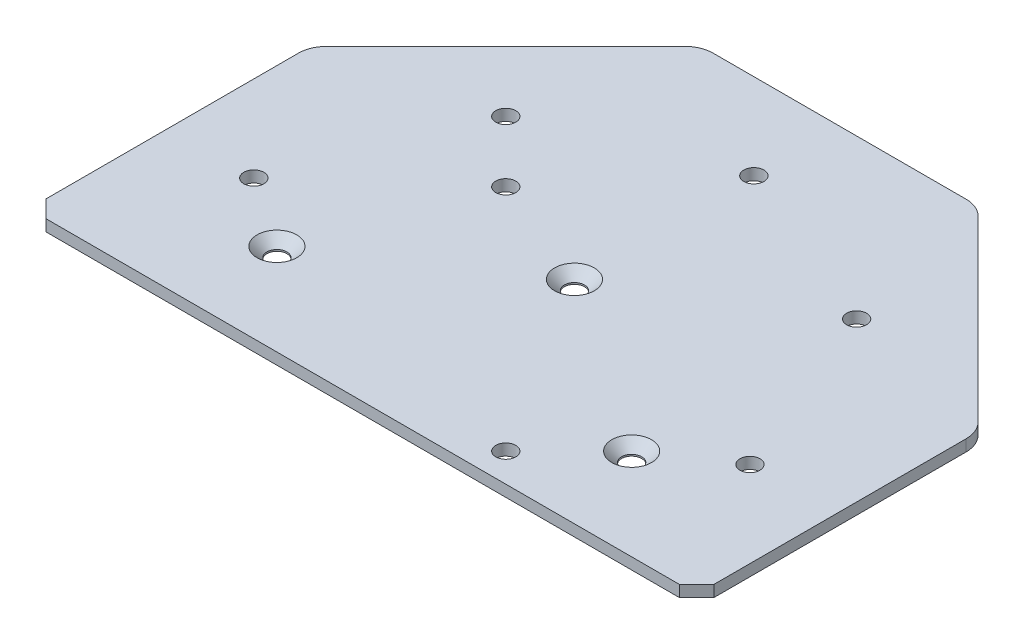
ISO-10303-21;
HEADER;
FILE_DESCRIPTION(('STEP AP214'),'2;1');
FILE_NAME('part.step','',(''),(''),'','','');
FILE_SCHEMA(('AUTOMOTIVE_DESIGN { 1 0 10303 214 1 1 1 1 }'));
ENDSEC;
DATA;
#1=APPLICATION_CONTEXT('core data for automotive mechanical design processes');
#2=APPLICATION_PROTOCOL_DEFINITION('international standard','automotive_design',2000,#1);
#3=PRODUCT_CONTEXT('',#1,'mechanical');
#4=PRODUCT('Part','Part','',(#3));
#5=PRODUCT_RELATED_PRODUCT_CATEGORY('part','',(#4));
#6=PRODUCT_DEFINITION_FORMATION('','',#4);
#7=PRODUCT_DEFINITION_CONTEXT('part definition',#1,'design');
#8=PRODUCT_DEFINITION('design','',#6,#7);
#9=PRODUCT_DEFINITION_SHAPE('','',#8);
#10=(LENGTH_UNIT() NAMED_UNIT(*) SI_UNIT(.MILLI.,.METRE.));
#11=(NAMED_UNIT(*) PLANE_ANGLE_UNIT() SI_UNIT($,.RADIAN.));
#12=(NAMED_UNIT(*) SI_UNIT($,.STERADIAN.) SOLID_ANGLE_UNIT());
#13=UNCERTAINTY_MEASURE_WITH_UNIT(LENGTH_MEASURE(1.E-05),#10,'distance_accuracy_value','');
#14=(GEOMETRIC_REPRESENTATION_CONTEXT(3) GLOBAL_UNCERTAINTY_ASSIGNED_CONTEXT((#13)) GLOBAL_UNIT_ASSIGNED_CONTEXT((#10,
#11,#12)) REPRESENTATION_CONTEXT('',''));
#15=CARTESIAN_POINT('',(0.,0.,0.));
#16=DIRECTION('',(0.,0.,1.));
#17=DIRECTION('',(1.,0.,0.));
#18=AXIS2_PLACEMENT_3D('',#15,#16,#17);
#19=CARTESIAN_POINT('',(58.3553390593275,2.,0.));
#20=DIRECTION('',(-1.,0.,0.));
#21=DIRECTION('',(0.,0.,1.));
#22=AXIS2_PLACEMENT_3D('',#19,#20,#21);
#23=PLANE('',#22);
#24=DIRECTION('',(0.,0.,-1.));
#25=VECTOR('',#24,1.);
#26=CARTESIAN_POINT('',(58.3553390593275,0.,0.));
#27=LINE('',#26,#25);
#28=CARTESIAN_POINT('',(58.3553390593275,0.,-3.));
#29=VERTEX_POINT('',#28);
#30=CARTESIAN_POINT('',(58.3553390593275,0.,-47.1005050633883));
#31=VERTEX_POINT('',#30);
#32=EDGE_CURVE('E141',#29,#31,#27,.T.);
#33=ORIENTED_EDGE('',*,*,#32,.T.);
#34=DIRECTION('',(0.,-1.,0.));
#35=VECTOR('',#34,1.);
#36=CARTESIAN_POINT('',(58.3553390593275,2.,-47.1005050633883));
#37=LINE('',#36,#35);
#38=CARTESIAN_POINT('',(58.3553390593275,2.,-47.1005050633883));
#39=VERTEX_POINT('',#38);
#40=EDGE_CURVE('E194',#31,#39,#37,.F.);
#41=ORIENTED_EDGE('',*,*,#40,.T.);
#42=DIRECTION('',(0.,0.,-1.));
#43=VECTOR('',#42,1.);
#44=CARTESIAN_POINT('',(58.3553390593275,2.,0.));
#45=LINE('',#44,#43);
#46=CARTESIAN_POINT('',(58.3553390593275,2.,-3.00000000000001));
#47=VERTEX_POINT('',#46);
#48=EDGE_CURVE('E144',#47,#39,#45,.T.);
#49=ORIENTED_EDGE('',*,*,#48,.F.);
#50=DIRECTION('',(0.,-1.,0.));
#51=VECTOR('',#50,1.);
#52=CARTESIAN_POINT('',(58.3553390593275,2.,-3.));
#53=LINE('',#52,#51);
#54=EDGE_CURVE('E129',#47,#29,#53,.T.);
#55=ORIENTED_EDGE('',*,*,#54,.T.);
#56=EDGE_LOOP('',(#33,#41,#49,#55));
#57=FACE_BOUND('',#56,.T.);
#58=ADVANCED_FACE('F32',(#57),#23,.F.);
#59=CARTESIAN_POINT('',(58.3553390593275,2.,-49.1715728752538));
#60=DIRECTION('',(-0.707106781186547,0.,0.707106781186547));
#61=DIRECTION('',(0.707106781186548,0.,0.707106781186548));
#62=AXIS2_PLACEMENT_3D('',#59,#60,#61);
#63=PLANE('',#62);
#64=DIRECTION('',(-0.707106781186548,0.,-0.707106781186548));
#65=VECTOR('',#64,1.);
#66=CARTESIAN_POINT('',(58.3553390593275,2.,-49.1715728752538));
#67=LINE('',#66,#65);
#68=CARTESIAN_POINT('',(56.8908729652602,2.,-50.636038969321));
#69=VERTEX_POINT('',#68);
#70=CARTESIAN_POINT('',(25.6360389693212,2.,-81.89087296526));
#71=VERTEX_POINT('',#70);
#72=EDGE_CURVE('E277',#69,#71,#67,.T.);
#73=ORIENTED_EDGE('',*,*,#72,.F.);
#74=DIRECTION('',(0.,-1.,0.));
#75=VECTOR('',#74,1.);
#76=CARTESIAN_POINT('',(56.8908729652602,2.,-50.636038969321));
#77=LINE('',#76,#75);
#78=CARTESIAN_POINT('',(56.8908729652602,0.,-50.636038969321));
#79=VERTEX_POINT('',#78);
#80=EDGE_CURVE('E184',#69,#79,#77,.T.);
#81=ORIENTED_EDGE('',*,*,#80,.T.);
#82=DIRECTION('',(-0.707106781186548,0.,-0.707106781186548));
#83=VECTOR('',#82,1.);
#84=CARTESIAN_POINT('',(58.3553390593275,0.,-49.1715728752538));
#85=LINE('',#84,#83);
#86=CARTESIAN_POINT('',(25.6360389693212,0.,-81.89087296526));
#87=VERTEX_POINT('',#86);
#88=EDGE_CURVE('E150',#79,#87,#85,.T.);
#89=ORIENTED_EDGE('',*,*,#88,.T.);
#90=DIRECTION('',(0.,-1.,0.));
#91=VECTOR('',#90,1.);
#92=CARTESIAN_POINT('',(25.6360389693212,2.,-81.89087296526));
#93=LINE('',#92,#91);
#94=EDGE_CURVE('E182',#87,#71,#93,.F.);
#95=ORIENTED_EDGE('',*,*,#94,.T.);
#96=EDGE_LOOP('',(#73,#81,#89,#95));
#97=FACE_BOUND('',#96,.T.);
#98=ADVANCED_FACE('F314',(#97),#63,.F.);
#99=CARTESIAN_POINT('',(24.1715728752539,2.,-83.3553390593273));
#100=DIRECTION('',(0.,0.,1.));
#101=DIRECTION('',(1.,0.,0.));
#102=AXIS2_PLACEMENT_3D('',#99,#100,#101);
#103=PLANE('',#102);
#104=DIRECTION('',(-1.,0.,0.));
#105=VECTOR('',#104,1.);
#106=CARTESIAN_POINT('',(24.1715728752539,2.,-83.3553390593273));
#107=LINE('',#106,#105);
#108=CARTESIAN_POINT('',(22.1005050633884,2.,-83.3553390593273));
#109=VERTEX_POINT('',#108);
#110=CARTESIAN_POINT('',(-22.1005050633884,2.,-83.3553390593273));
#111=VERTEX_POINT('',#110);
#112=EDGE_CURVE('E280',#109,#111,#107,.T.);
#113=ORIENTED_EDGE('',*,*,#112,.F.);
#114=DIRECTION('',(0.,-1.,0.));
#115=VECTOR('',#114,1.);
#116=CARTESIAN_POINT('',(22.1005050633884,2.,-83.3553390593273));
#117=LINE('',#116,#115);
#118=CARTESIAN_POINT('',(22.1005050633884,0.,-83.3553390593273));
#119=VERTEX_POINT('',#118);
#120=EDGE_CURVE('E205',#109,#119,#117,.T.);
#121=ORIENTED_EDGE('',*,*,#120,.T.);
#122=DIRECTION('',(-1.,0.,0.));
#123=VECTOR('',#122,1.);
#124=CARTESIAN_POINT('',(24.1715728752539,0.,-83.3553390593273));
#125=LINE('',#124,#123);
#126=CARTESIAN_POINT('',(-22.1005050633884,0.,-83.3553390593273));
#127=VERTEX_POINT('',#126);
#128=EDGE_CURVE('E154',#119,#127,#125,.T.);
#129=ORIENTED_EDGE('',*,*,#128,.T.);
#130=DIRECTION('',(0.,-1.,0.));
#131=VECTOR('',#130,1.);
#132=CARTESIAN_POINT('',(-22.1005050633884,2.,-83.3553390593273));
#133=LINE('',#132,#131);
#134=EDGE_CURVE('E203',#127,#111,#133,.F.);
#135=ORIENTED_EDGE('',*,*,#134,.T.);
#136=EDGE_LOOP('',(#113,#121,#129,#135));
#137=FACE_BOUND('',#136,.T.);
#138=ADVANCED_FACE('F319',(#137),#103,.F.);
#139=CARTESIAN_POINT('',(-58.3553390593275,2.,-49.1715728752538));
#140=DIRECTION('',(0.707106781186547,0.,0.707106781186547));
#141=DIRECTION('',(0.707106781186548,0.,-0.707106781186548));
#142=AXIS2_PLACEMENT_3D('',#139,#140,#141);
#143=PLANE('',#142);
#144=DIRECTION('',(-0.707106781186548,0.,0.707106781186548));
#145=VECTOR('',#144,1.);
#146=CARTESIAN_POINT('',(-58.3553390593275,2.,-49.1715728752538));
#147=LINE('',#146,#145);
#148=CARTESIAN_POINT('',(-25.6360389693212,2.,-81.89087296526));
#149=VERTEX_POINT('',#148);
#150=CARTESIAN_POINT('',(-56.8908729652602,2.,-50.636038969321));
#151=VERTEX_POINT('',#150);
#152=EDGE_CURVE('E283',#149,#151,#147,.T.);
#153=ORIENTED_EDGE('',*,*,#152,.F.);
#154=DIRECTION('',(0.,-1.,0.));
#155=VECTOR('',#154,1.);
#156=CARTESIAN_POINT('',(-25.6360389693212,2.,-81.89087296526));
#157=LINE('',#156,#155);
#158=CARTESIAN_POINT('',(-25.6360389693212,0.,-81.89087296526));
#159=VERTEX_POINT('',#158);
#160=EDGE_CURVE('E41',#149,#159,#157,.T.);
#161=ORIENTED_EDGE('',*,*,#160,.T.);
#162=DIRECTION('',(-0.707106781186548,0.,0.707106781186548));
#163=VECTOR('',#162,1.);
#164=CARTESIAN_POINT('',(-58.3553390593275,0.,-49.1715728752538));
#165=LINE('',#164,#163);
#166=CARTESIAN_POINT('',(-56.8908729652602,0.,-50.636038969321));
#167=VERTEX_POINT('',#166);
#168=EDGE_CURVE('E164',#159,#167,#165,.T.);
#169=ORIENTED_EDGE('',*,*,#168,.T.);
#170=DIRECTION('',(0.,-1.,0.));
#171=VECTOR('',#170,1.);
#172=CARTESIAN_POINT('',(-56.8908729652602,2.,-50.636038969321));
#173=LINE('',#172,#171);
#174=EDGE_CURVE('E57',#167,#151,#173,.F.);
#175=ORIENTED_EDGE('',*,*,#174,.T.);
#176=EDGE_LOOP('',(#153,#161,#169,#175));
#177=FACE_BOUND('',#176,.T.);
#178=ADVANCED_FACE('F347',(#177),#143,.F.);
#179=CARTESIAN_POINT('',(-58.3553390593275,2.,0.));
#180=DIRECTION('',(1.,0.,0.));
#181=DIRECTION('',(0.,0.,-1.));
#182=AXIS2_PLACEMENT_3D('',#179,#180,#181);
#183=PLANE('',#182);
#184=DIRECTION('',(0.,0.,1.));
#185=VECTOR('',#184,1.);
#186=CARTESIAN_POINT('',(-58.3553390593275,2.,0.));
#187=LINE('',#186,#185);
#188=CARTESIAN_POINT('',(-58.3553390593275,2.,-47.1005050633883));
#189=VERTEX_POINT('',#188);
#190=CARTESIAN_POINT('',(-58.3553390593275,2.,-2.99999999999998));
#191=VERTEX_POINT('',#190);
#192=EDGE_CURVE('E284',#189,#191,#187,.T.);
#193=ORIENTED_EDGE('',*,*,#192,.F.);
#194=DIRECTION('',(0.,-1.,0.));
#195=VECTOR('',#194,1.);
#196=CARTESIAN_POINT('',(-58.3553390593275,2.,-47.1005050633883));
#197=LINE('',#196,#195);
#198=CARTESIAN_POINT('',(-58.3553390593275,0.,-47.1005050633883));
#199=VERTEX_POINT('',#198);
#200=EDGE_CURVE('E11',#189,#199,#197,.T.);
#201=ORIENTED_EDGE('',*,*,#200,.T.);
#202=DIRECTION('',(0.,0.,1.));
#203=VECTOR('',#202,1.);
#204=CARTESIAN_POINT('',(-58.3553390593275,0.,0.));
#205=LINE('',#204,#203);
#206=CARTESIAN_POINT('',(-58.3553390593275,0.,-3.00000000000002));
#207=VERTEX_POINT('',#206);
#208=EDGE_CURVE('E166',#199,#207,#205,.T.);
#209=ORIENTED_EDGE('',*,*,#208,.T.);
#210=DIRECTION('',(0.,1.,0.));
#211=VECTOR('',#210,1.);
#212=CARTESIAN_POINT('',(-58.3553390593275,2.,-3.00000000000002));
#213=LINE('',#212,#211);
#214=EDGE_CURVE('E179',#207,#191,#213,.T.);
#215=ORIENTED_EDGE('',*,*,#214,.T.);
#216=EDGE_LOOP('',(#193,#201,#209,#215));
#217=FACE_BOUND('',#216,.T.);
#218=ADVANCED_FACE('F298',(#217),#183,.F.);
#219=CARTESIAN_POINT('',(-58.3553390593275,2.,0.));
#220=DIRECTION('',(0.,0.,-1.));
#221=DIRECTION('',(-1.,0.,0.));
#222=AXIS2_PLACEMENT_3D('',#219,#220,#221);
#223=PLANE('',#222);
#224=DIRECTION('',(1.,0.,0.));
#225=VECTOR('',#224,1.);
#226=CARTESIAN_POINT('',(-58.3553390593275,0.,0.));
#227=LINE('',#226,#225);
#228=CARTESIAN_POINT('',(-55.3553390593275,0.,0.));
#229=VERTEX_POINT('',#228);
#230=CARTESIAN_POINT('',(55.3553390593274,0.,0.));
#231=VERTEX_POINT('',#230);
#232=EDGE_CURVE('E168',#229,#231,#227,.T.);
#233=ORIENTED_EDGE('',*,*,#232,.T.);
#234=DIRECTION('',(0.,1.,0.));
#235=VECTOR('',#234,1.);
#236=CARTESIAN_POINT('',(55.3553390593274,2.,0.));
#237=LINE('',#236,#235);
#238=CARTESIAN_POINT('',(55.3553390593275,2.,0.));
#239=VERTEX_POINT('',#238);
#240=EDGE_CURVE('E130',#231,#239,#237,.T.);
#241=ORIENTED_EDGE('',*,*,#240,.T.);
#242=DIRECTION('',(1.,0.,0.));
#243=VECTOR('',#242,1.);
#244=CARTESIAN_POINT('',(-58.3553390593275,2.,0.));
#245=LINE('',#244,#243);
#246=CARTESIAN_POINT('',(-55.3553390593275,2.,0.));
#247=VERTEX_POINT('',#246);
#248=EDGE_CURVE('E145',#247,#239,#245,.T.);
#249=ORIENTED_EDGE('',*,*,#248,.F.);
#250=DIRECTION('',(0.,-1.,0.));
#251=VECTOR('',#250,1.);
#252=CARTESIAN_POINT('',(-55.3553390593275,2.,0.));
#253=LINE('',#252,#251);
#254=EDGE_CURVE('E135',#247,#229,#253,.T.);
#255=ORIENTED_EDGE('',*,*,#254,.T.);
#256=EDGE_LOOP('',(#233,#241,#249,#255));
#257=FACE_BOUND('',#256,.T.);
#258=ADVANCED_FACE('F291',(#257),#223,.F.);
#259=CARTESIAN_POINT('',(58.3553390593275,2.,-83.3553390593273));
#260=DIRECTION('',(0.,1.,0.));
#261=DIRECTION('',(0.,0.,1.));
#262=AXIS2_PLACEMENT_3D('',#259,#260,#261);
#263=PLANE('',#262);
#264=CARTESIAN_POINT('',(0.,2.,-37.));
#265=DIRECTION('',(0.,1.,0.));
#266=DIRECTION('',(0.,0.,1.));
#267=AXIS2_PLACEMENT_3D('',#264,#265,#266);
#268=CIRCLE('',#267,3.47);
#269=CARTESIAN_POINT('',(0.,2.,-33.53));
#270=VERTEX_POINT('',#269);
#271=EDGE_CURVE('E227',#270,#270,#268,.T.);
#272=ORIENTED_EDGE('',*,*,#271,.F.);
#273=EDGE_LOOP('',(#272));
#274=FACE_BOUND('',#273,.T.);
#275=CARTESIAN_POINT('',(-31.,2.,-16.));
#276=DIRECTION('',(0.,1.,0.));
#277=DIRECTION('',(0.,0.,1.));
#278=AXIS2_PLACEMENT_3D('',#275,#276,#277);
#279=CIRCLE('',#278,3.47);
#280=CARTESIAN_POINT('',(-31.,2.,-12.53));
#281=VERTEX_POINT('',#280);
#282=EDGE_CURVE('E217',#281,#281,#279,.T.);
#283=ORIENTED_EDGE('',*,*,#282,.F.);
#284=EDGE_LOOP('',(#283));
#285=FACE_BOUND('',#284,.T.);
#286=CARTESIAN_POINT('',(31.,2.,-16.));
#287=DIRECTION('',(0.,1.,0.));
#288=DIRECTION('',(0.,0.,1.));
#289=AXIS2_PLACEMENT_3D('',#286,#287,#288);
#290=CIRCLE('',#289,3.47);
#291=CARTESIAN_POINT('',(31.,2.,-12.53));
#292=VERTEX_POINT('',#291);
#293=EDGE_CURVE('E214',#292,#292,#290,.T.);
#294=ORIENTED_EDGE('',*,*,#293,.F.);
#295=EDGE_LOOP('',(#294));
#296=FACE_BOUND('',#295,.T.);
#297=CARTESIAN_POINT('',(20.,2.,-5.));
#298=DIRECTION('',(0.,1.,0.));
#299=DIRECTION('',(0.,0.,1.));
#300=AXIS2_PLACEMENT_3D('',#297,#298,#299);
#301=CIRCLE('',#300,1.75);
#302=CARTESIAN_POINT('',(20.,2.,-3.25));
#303=VERTEX_POINT('',#302);
#304=EDGE_CURVE('E238',#303,#303,#301,.T.);
#305=ORIENTED_EDGE('',*,*,#304,.F.);
#306=EDGE_LOOP('',(#305));
#307=FACE_BOUND('',#306,.T.);
#308=CARTESIAN_POINT('',(-20.,2.,-45.));
#309=DIRECTION('',(0.,1.,0.));
#310=DIRECTION('',(0.,0.,1.));
#311=AXIS2_PLACEMENT_3D('',#308,#309,#310);
#312=CIRCLE('',#311,1.75);
#313=CARTESIAN_POINT('',(-20.,2.,-43.25));
#314=VERTEX_POINT('',#313);
#315=EDGE_CURVE('E244',#314,#314,#312,.T.);
#316=ORIENTED_EDGE('',*,*,#315,.F.);
#317=EDGE_LOOP('',(#316));
#318=FACE_BOUND('',#317,.T.);
#319=CARTESIAN_POINT('',(43.3553390593275,2.,-24.3151883875538));
#320=DIRECTION('',(0.,1.,0.));
#321=DIRECTION('',(0.,0.,1.));
#322=AXIS2_PLACEMENT_3D('',#319,#320,#321);
#323=CIRCLE('',#322,1.75);
#324=CARTESIAN_POINT('',(43.3553390593275,2.,-22.5651883875538));
#325=VERTEX_POINT('',#324);
#326=EDGE_CURVE('E250',#325,#325,#323,.F.);
#327=ORIENTED_EDGE('',*,*,#326,.T.);
#328=EDGE_LOOP('',(#327));
#329=FACE_BOUND('',#328,.T.);
#330=CARTESIAN_POINT('',(30.6568542494924,2.,-55.6568542494923));
#331=DIRECTION('',(0.,1.,0.));
#332=DIRECTION('',(0.,0.,1.));
#333=AXIS2_PLACEMENT_3D('',#330,#331,#332);
#334=CIRCLE('',#333,1.75);
#335=CARTESIAN_POINT('',(30.6568542494924,2.,-53.9068542494923));
#336=VERTEX_POINT('',#335);
#337=EDGE_CURVE('E254',#336,#336,#334,.F.);
#338=ORIENTED_EDGE('',*,*,#337,.T.);
#339=EDGE_LOOP('',(#338));
#340=FACE_BOUND('',#339,.T.);
#341=CARTESIAN_POINT('',(0.,2.,-68.3553390593273));
#342=DIRECTION('',(0.,1.,0.));
#343=DIRECTION('',(0.,0.,1.));
#344=AXIS2_PLACEMENT_3D('',#341,#342,#343);
#345=CIRCLE('',#344,1.75);
#346=CARTESIAN_POINT('',(0.,2.,-66.6053390593273));
#347=VERTEX_POINT('',#346);
#348=EDGE_CURVE('E260',#347,#347,#345,.F.);
#349=ORIENTED_EDGE('',*,*,#348,.T.);
#350=EDGE_LOOP('',(#349));
#351=FACE_BOUND('',#350,.T.);
#352=CARTESIAN_POINT('',(-30.6568542494925,2.,-55.6568542494923));
#353=DIRECTION('',(0.,1.,0.));
#354=DIRECTION('',(0.,0.,1.));
#355=AXIS2_PLACEMENT_3D('',#352,#353,#354);
#356=CIRCLE('',#355,1.75);
#357=CARTESIAN_POINT('',(-30.6568542494925,2.,-53.9068542494923));
#358=VERTEX_POINT('',#357);
#359=EDGE_CURVE('E266',#358,#358,#356,.F.);
#360=ORIENTED_EDGE('',*,*,#359,.T.);
#361=EDGE_LOOP('',(#360));
#362=FACE_BOUND('',#361,.T.);
#363=CARTESIAN_POINT('',(-43.3553390593275,2.,-24.3151883875538));
#364=DIRECTION('',(0.,1.,0.));
#365=DIRECTION('',(0.,0.,1.));
#366=AXIS2_PLACEMENT_3D('',#363,#364,#365);
#367=CIRCLE('',#366,1.75);
#368=CARTESIAN_POINT('',(-43.3553390593275,2.,-22.5651883875538));
#369=VERTEX_POINT('',#368);
#370=EDGE_CURVE('E157',#369,#369,#367,.F.);
#371=ORIENTED_EDGE('',*,*,#370,.T.);
#372=EDGE_LOOP('',(#371));
#373=FACE_BOUND('',#372,.T.);
#374=ORIENTED_EDGE('',*,*,#48,.T.);
#375=CARTESIAN_POINT('',(53.3553390593275,2.,-47.1005050633883));
#376=DIRECTION('',(0.,1.,0.));
#377=DIRECTION('',(0.,0.,1.));
#378=AXIS2_PLACEMENT_3D('',#375,#376,#377);
#379=CIRCLE('',#378,5.);
#380=EDGE_CURVE('E201',#39,#69,#379,.T.);
#381=ORIENTED_EDGE('',*,*,#380,.T.);
#382=ORIENTED_EDGE('',*,*,#72,.T.);
#383=CARTESIAN_POINT('',(22.1005050633884,2.,-78.3553390593273));
#384=DIRECTION('',(0.,1.,0.));
#385=DIRECTION('',(0.,0.,1.));
#386=AXIS2_PLACEMENT_3D('',#383,#384,#385);
#387=CIRCLE('',#386,5.);
#388=EDGE_CURVE('E199',#71,#109,#387,.T.);
#389=ORIENTED_EDGE('',*,*,#388,.T.);
#390=ORIENTED_EDGE('',*,*,#112,.T.);
#391=CARTESIAN_POINT('',(-22.1005050633884,2.,-78.3553390593273));
#392=DIRECTION('',(0.,1.,0.));
#393=DIRECTION('',(0.,0.,1.));
#394=AXIS2_PLACEMENT_3D('',#391,#392,#393);
#395=CIRCLE('',#394,5.);
#396=EDGE_CURVE('E197',#111,#149,#395,.T.);
#397=ORIENTED_EDGE('',*,*,#396,.T.);
#398=ORIENTED_EDGE('',*,*,#152,.T.);
#399=CARTESIAN_POINT('',(-53.3553390593275,2.,-47.1005050633883));
#400=DIRECTION('',(0.,1.,0.));
#401=DIRECTION('',(0.,0.,1.));
#402=AXIS2_PLACEMENT_3D('',#399,#400,#401);
#403=CIRCLE('',#402,5.);
#404=EDGE_CURVE('E49',#151,#189,#403,.T.);
#405=ORIENTED_EDGE('',*,*,#404,.T.);
#406=ORIENTED_EDGE('',*,*,#192,.T.);
#407=DIRECTION('',(-0.707106781186546,0.,-0.707106781186549));
#408=VECTOR('',#407,1.);
#409=CARTESIAN_POINT('',(-40.1776695296639,2.,15.1776695296636));
#410=LINE('',#409,#408);
#411=EDGE_CURVE('E175',#191,#247,#410,.F.);
#412=ORIENTED_EDGE('',*,*,#411,.T.);
#413=ORIENTED_EDGE('',*,*,#248,.T.);
#414=DIRECTION('',(-0.707106781186549,0.,0.707106781186546));
#415=VECTOR('',#414,1.);
#416=CARTESIAN_POINT('',(98.5330085889911,2.,-43.1776695296635));
#417=LINE('',#416,#415);
#418=EDGE_CURVE('E177',#239,#47,#417,.F.);
#419=ORIENTED_EDGE('',*,*,#418,.T.);
#420=EDGE_LOOP('',(#374,#381,#382,#389,#390,#397,#398,#405,#406,#412,#413,#419));
#421=FACE_BOUND('',#420,.T.);
#422=ADVANCED_FACE('F287',(#274,#285,#296,#307,#318,#329,#340,#351,#362,#373,#421),#263,.T.);
#423=CARTESIAN_POINT('',(58.3553390593275,0.,-83.3553390593273));
#424=DIRECTION('',(0.,1.,0.));
#425=DIRECTION('',(0.,0.,1.));
#426=AXIS2_PLACEMENT_3D('',#423,#424,#425);
#427=PLANE('',#426);
#428=CARTESIAN_POINT('',(31.,0.,-16.));
#429=DIRECTION('',(0.,1.,0.));
#430=DIRECTION('',(0.,0.,1.));
#431=AXIS2_PLACEMENT_3D('',#428,#429,#430);
#432=CIRCLE('',#431,1.75);
#433=CARTESIAN_POINT('',(31.,0.,-14.25));
#434=VERTEX_POINT('',#433);
#435=EDGE_CURVE('E213',#434,#434,#432,.F.);
#436=ORIENTED_EDGE('',*,*,#435,.F.);
#437=EDGE_LOOP('',(#436));
#438=FACE_BOUND('',#437,.T.);
#439=CARTESIAN_POINT('',(-31.,0.,-16.));
#440=DIRECTION('',(0.,1.,0.));
#441=DIRECTION('',(0.,0.,1.));
#442=AXIS2_PLACEMENT_3D('',#439,#440,#441);
#443=CIRCLE('',#442,1.75);
#444=CARTESIAN_POINT('',(-31.,0.,-14.25));
#445=VERTEX_POINT('',#444);
#446=EDGE_CURVE('E232',#445,#445,#443,.F.);
#447=ORIENTED_EDGE('',*,*,#446,.F.);
#448=EDGE_LOOP('',(#447));
#449=FACE_BOUND('',#448,.T.);
#450=CARTESIAN_POINT('',(0.,0.,-37.));
#451=DIRECTION('',(0.,1.,0.));
#452=DIRECTION('',(0.,0.,1.));
#453=AXIS2_PLACEMENT_3D('',#450,#451,#452);
#454=CIRCLE('',#453,1.75);
#455=CARTESIAN_POINT('',(0.,0.,-35.25));
#456=VERTEX_POINT('',#455);
#457=EDGE_CURVE('E235',#456,#456,#454,.F.);
#458=ORIENTED_EDGE('',*,*,#457,.F.);
#459=EDGE_LOOP('',(#458));
#460=FACE_BOUND('',#459,.T.);
#461=CARTESIAN_POINT('',(20.,0.,-5.));
#462=DIRECTION('',(0.,1.,0.));
#463=DIRECTION('',(0.,0.,1.));
#464=AXIS2_PLACEMENT_3D('',#461,#462,#463);
#465=CIRCLE('',#464,1.75);
#466=CARTESIAN_POINT('',(20.,0.,-3.25));
#467=VERTEX_POINT('',#466);
#468=EDGE_CURVE('E241',#467,#467,#465,.F.);
#469=ORIENTED_EDGE('',*,*,#468,.F.);
#470=EDGE_LOOP('',(#469));
#471=FACE_BOUND('',#470,.T.);
#472=CARTESIAN_POINT('',(-20.,0.,-45.));
#473=DIRECTION('',(0.,1.,0.));
#474=DIRECTION('',(0.,0.,1.));
#475=AXIS2_PLACEMENT_3D('',#472,#473,#474);
#476=CIRCLE('',#475,1.75);
#477=CARTESIAN_POINT('',(-20.,0.,-43.25));
#478=VERTEX_POINT('',#477);
#479=EDGE_CURVE('E247',#478,#478,#476,.F.);
#480=ORIENTED_EDGE('',*,*,#479,.F.);
#481=EDGE_LOOP('',(#480));
#482=FACE_BOUND('',#481,.T.);
#483=CARTESIAN_POINT('',(43.3553390593275,0.,-24.3151883875538));
#484=DIRECTION('',(0.,-1.,0.));
#485=DIRECTION('',(0.,0.,-1.));
#486=AXIS2_PLACEMENT_3D('',#483,#484,#485);
#487=CIRCLE('',#486,1.75);
#488=CARTESIAN_POINT('',(43.3553390593275,0.,-26.0651883875538));
#489=VERTEX_POINT('',#488);
#490=EDGE_CURVE('E251',#489,#489,#487,.T.);
#491=ORIENTED_EDGE('',*,*,#490,.F.);
#492=EDGE_LOOP('',(#491));
#493=FACE_BOUND('',#492,.T.);
#494=CARTESIAN_POINT('',(30.6568542494924,0.,-55.6568542494923));
#495=DIRECTION('',(0.,-1.,0.));
#496=DIRECTION('',(0.,0.,-1.));
#497=AXIS2_PLACEMENT_3D('',#494,#495,#496);
#498=CIRCLE('',#497,1.75);
#499=CARTESIAN_POINT('',(30.6568542494924,0.,-57.4068542494923));
#500=VERTEX_POINT('',#499);
#501=EDGE_CURVE('E257',#500,#500,#498,.T.);
#502=ORIENTED_EDGE('',*,*,#501,.F.);
#503=EDGE_LOOP('',(#502));
#504=FACE_BOUND('',#503,.T.);
#505=CARTESIAN_POINT('',(0.,0.,-68.3553390593273));
#506=DIRECTION('',(0.,-1.,0.));
#507=DIRECTION('',(0.,0.,-1.));
#508=AXIS2_PLACEMENT_3D('',#505,#506,#507);
#509=CIRCLE('',#508,1.75);
#510=CARTESIAN_POINT('',(0.,0.,-70.1053390593273));
#511=VERTEX_POINT('',#510);
#512=EDGE_CURVE('E263',#511,#511,#509,.T.);
#513=ORIENTED_EDGE('',*,*,#512,.F.);
#514=EDGE_LOOP('',(#513));
#515=FACE_BOUND('',#514,.T.);
#516=CARTESIAN_POINT('',(-30.6568542494925,0.,-55.6568542494923));
#517=DIRECTION('',(0.,-1.,0.));
#518=DIRECTION('',(0.,0.,-1.));
#519=AXIS2_PLACEMENT_3D('',#516,#517,#518);
#520=CIRCLE('',#519,1.75);
#521=CARTESIAN_POINT('',(-30.6568542494925,0.,-57.4068542494923));
#522=VERTEX_POINT('',#521);
#523=EDGE_CURVE('E269',#522,#522,#520,.T.);
#524=ORIENTED_EDGE('',*,*,#523,.F.);
#525=EDGE_LOOP('',(#524));
#526=FACE_BOUND('',#525,.T.);
#527=CARTESIAN_POINT('',(-43.3553390593275,0.,-24.3151883875538));
#528=DIRECTION('',(0.,-1.,0.));
#529=DIRECTION('',(0.,0.,-1.));
#530=AXIS2_PLACEMENT_3D('',#527,#528,#529);
#531=CIRCLE('',#530,1.75);
#532=CARTESIAN_POINT('',(-43.3553390593275,0.,-26.0651883875538));
#533=VERTEX_POINT('',#532);
#534=EDGE_CURVE('E151',#533,#533,#531,.T.);
#535=ORIENTED_EDGE('',*,*,#534,.F.);
#536=EDGE_LOOP('',(#535));
#537=FACE_BOUND('',#536,.T.);
#538=ORIENTED_EDGE('',*,*,#88,.F.);
#539=CARTESIAN_POINT('',(53.3553390593275,0.,-47.1005050633883));
#540=DIRECTION('',(0.,1.,0.));
#541=DIRECTION('',(0.,0.,1.));
#542=AXIS2_PLACEMENT_3D('',#539,#540,#541);
#543=CIRCLE('',#542,5.);
#544=EDGE_CURVE('E149',#79,#31,#543,.F.);
#545=ORIENTED_EDGE('',*,*,#544,.T.);
#546=ORIENTED_EDGE('',*,*,#32,.F.);
#547=DIRECTION('',(0.707106781186549,0.,-0.707106781186546));
#548=VECTOR('',#547,1.);
#549=CARTESIAN_POINT('',(58.3553390593275,0.,-3.));
#550=LINE('',#549,#548);
#551=EDGE_CURVE('E125',#29,#231,#550,.F.);
#552=ORIENTED_EDGE('',*,*,#551,.T.);
#553=ORIENTED_EDGE('',*,*,#232,.F.);
#554=DIRECTION('',(0.707106781186546,0.,0.707106781186549));
#555=VECTOR('',#554,1.);
#556=CARTESIAN_POINT('',(-55.3553390593275,0.,0.));
#557=LINE('',#556,#555);
#558=EDGE_CURVE('E136',#229,#207,#557,.F.);
#559=ORIENTED_EDGE('',*,*,#558,.T.);
#560=ORIENTED_EDGE('',*,*,#208,.F.);
#561=CARTESIAN_POINT('',(-53.3553390593275,0.,-47.1005050633883));
#562=DIRECTION('',(0.,1.,0.));
#563=DIRECTION('',(0.,0.,1.));
#564=AXIS2_PLACEMENT_3D('',#561,#562,#563);
#565=CIRCLE('',#564,5.);
#566=EDGE_CURVE('E187',#199,#167,#565,.F.);
#567=ORIENTED_EDGE('',*,*,#566,.T.);
#568=ORIENTED_EDGE('',*,*,#168,.F.);
#569=CARTESIAN_POINT('',(-22.1005050633884,0.,-78.3553390593273));
#570=DIRECTION('',(0.,1.,0.));
#571=DIRECTION('',(0.,0.,1.));
#572=AXIS2_PLACEMENT_3D('',#569,#570,#571);
#573=CIRCLE('',#572,5.);
#574=EDGE_CURVE('E189',#159,#127,#573,.F.);
#575=ORIENTED_EDGE('',*,*,#574,.T.);
#576=ORIENTED_EDGE('',*,*,#128,.F.);
#577=CARTESIAN_POINT('',(22.1005050633884,0.,-78.3553390593273));
#578=DIRECTION('',(0.,1.,0.));
#579=DIRECTION('',(0.,0.,1.));
#580=AXIS2_PLACEMENT_3D('',#577,#578,#579);
#581=CIRCLE('',#580,5.);
#582=EDGE_CURVE('E191',#119,#87,#581,.F.);
#583=ORIENTED_EDGE('',*,*,#582,.T.);
#584=EDGE_LOOP('',(#538,#545,#546,#552,#553,#559,#560,#567,#568,#575,#576,#583));
#585=FACE_BOUND('',#584,.T.);
#586=ADVANCED_FACE('F148',(#438,#449,#460,#471,#482,#493,#504,#515,#526,#537,#585),#427,.F.);
#587=CARTESIAN_POINT('',(-43.3553390593275,2.001,-24.3151883875538));
#588=DIRECTION('',(0.,-1.,0.));
#589=DIRECTION('',(0.,0.,-1.));
#590=AXIS2_PLACEMENT_3D('',#587,#588,#589);
#591=CYLINDRICAL_SURFACE('',#590,1.75);
#592=ORIENTED_EDGE('',*,*,#370,.F.);
#593=EDGE_LOOP('',(#592));
#594=FACE_BOUND('',#593,.T.);
#595=ORIENTED_EDGE('',*,*,#534,.T.);
#596=EDGE_LOOP('',(#595));
#597=FACE_BOUND('',#596,.T.);
#598=ADVANCED_FACE('F362',(#594,#597),#591,.F.);
#599=CARTESIAN_POINT('',(-30.6568542494925,2.001,-55.6568542494923));
#600=DIRECTION('',(0.,-1.,0.));
#601=DIRECTION('',(0.,0.,-1.));
#602=AXIS2_PLACEMENT_3D('',#599,#600,#601);
#603=CYLINDRICAL_SURFACE('',#602,1.75);
#604=ORIENTED_EDGE('',*,*,#359,.F.);
#605=EDGE_LOOP('',(#604));
#606=FACE_BOUND('',#605,.T.);
#607=ORIENTED_EDGE('',*,*,#523,.T.);
#608=EDGE_LOOP('',(#607));
#609=FACE_BOUND('',#608,.T.);
#610=ADVANCED_FACE('F369',(#606,#609),#603,.F.);
#611=CARTESIAN_POINT('',(0.,2.001,-68.3553390593273));
#612=DIRECTION('',(0.,-1.,0.));
#613=DIRECTION('',(0.,0.,-1.));
#614=AXIS2_PLACEMENT_3D('',#611,#612,#613);
#615=CYLINDRICAL_SURFACE('',#614,1.75);
#616=ORIENTED_EDGE('',*,*,#348,.F.);
#617=EDGE_LOOP('',(#616));
#618=FACE_BOUND('',#617,.T.);
#619=ORIENTED_EDGE('',*,*,#512,.T.);
#620=EDGE_LOOP('',(#619));
#621=FACE_BOUND('',#620,.T.);
#622=ADVANCED_FACE('F373',(#618,#621),#615,.F.);
#623=CARTESIAN_POINT('',(30.6568542494924,2.001,-55.6568542494923));
#624=DIRECTION('',(0.,-1.,0.));
#625=DIRECTION('',(0.,0.,-1.));
#626=AXIS2_PLACEMENT_3D('',#623,#624,#625);
#627=CYLINDRICAL_SURFACE('',#626,1.75);
#628=ORIENTED_EDGE('',*,*,#337,.F.);
#629=EDGE_LOOP('',(#628));
#630=FACE_BOUND('',#629,.T.);
#631=ORIENTED_EDGE('',*,*,#501,.T.);
#632=EDGE_LOOP('',(#631));
#633=FACE_BOUND('',#632,.T.);
#634=ADVANCED_FACE('F377',(#630,#633),#627,.F.);
#635=CARTESIAN_POINT('',(43.3553390593275,2.001,-24.3151883875538));
#636=DIRECTION('',(0.,-1.,0.));
#637=DIRECTION('',(0.,0.,-1.));
#638=AXIS2_PLACEMENT_3D('',#635,#636,#637);
#639=CYLINDRICAL_SURFACE('',#638,1.75);
#640=ORIENTED_EDGE('',*,*,#326,.F.);
#641=EDGE_LOOP('',(#640));
#642=FACE_BOUND('',#641,.T.);
#643=ORIENTED_EDGE('',*,*,#490,.T.);
#644=EDGE_LOOP('',(#643));
#645=FACE_BOUND('',#644,.T.);
#646=ADVANCED_FACE('F326',(#642,#645),#639,.F.);
#647=CARTESIAN_POINT('',(58.3553390593275,2.,-3.));
#648=DIRECTION('',(-0.707106781186546,0.,-0.707106781186549));
#649=DIRECTION('',(-0.707106781186549,0.,0.707106781186546));
#650=AXIS2_PLACEMENT_3D('',#647,#648,#649);
#651=PLANE('',#650);
#652=ORIENTED_EDGE('',*,*,#418,.F.);
#653=ORIENTED_EDGE('',*,*,#240,.F.);
#654=ORIENTED_EDGE('',*,*,#551,.F.);
#655=ORIENTED_EDGE('',*,*,#54,.F.);
#656=EDGE_LOOP('',(#652,#653,#654,#655));
#657=FACE_BOUND('',#656,.T.);
#658=ADVANCED_FACE('F128',(#657),#651,.F.);
#659=CARTESIAN_POINT('',(-55.3553390593275,2.,0.));
#660=DIRECTION('',(0.707106781186549,0.,-0.707106781186546));
#661=DIRECTION('',(-0.707106781186546,0.,-0.707106781186549));
#662=AXIS2_PLACEMENT_3D('',#659,#660,#661);
#663=PLANE('',#662);
#664=ORIENTED_EDGE('',*,*,#411,.F.);
#665=ORIENTED_EDGE('',*,*,#214,.F.);
#666=ORIENTED_EDGE('',*,*,#558,.F.);
#667=ORIENTED_EDGE('',*,*,#254,.F.);
#668=EDGE_LOOP('',(#664,#665,#666,#667));
#669=FACE_BOUND('',#668,.T.);
#670=ADVANCED_FACE('F293',(#669),#663,.F.);
#671=CARTESIAN_POINT('',(53.3553390593275,2.,-47.1005050633883));
#672=DIRECTION('',(0.,-1.,0.));
#673=DIRECTION('',(0.,0.,-1.));
#674=AXIS2_PLACEMENT_3D('',#671,#672,#673);
#675=CYLINDRICAL_SURFACE('',#674,5.);
#676=ORIENTED_EDGE('',*,*,#380,.F.);
#677=ORIENTED_EDGE('',*,*,#40,.F.);
#678=ORIENTED_EDGE('',*,*,#544,.F.);
#679=ORIENTED_EDGE('',*,*,#80,.F.);
#680=EDGE_LOOP('',(#676,#677,#678,#679));
#681=FACE_BOUND('',#680,.T.);
#682=ADVANCED_FACE('F329',(#681),#675,.T.);
#683=CARTESIAN_POINT('',(22.1005050633884,2.,-78.3553390593273));
#684=DIRECTION('',(0.,-1.,0.));
#685=DIRECTION('',(0.,0.,-1.));
#686=AXIS2_PLACEMENT_3D('',#683,#684,#685);
#687=CYLINDRICAL_SURFACE('',#686,5.);
#688=ORIENTED_EDGE('',*,*,#388,.F.);
#689=ORIENTED_EDGE('',*,*,#94,.F.);
#690=ORIENTED_EDGE('',*,*,#582,.F.);
#691=ORIENTED_EDGE('',*,*,#120,.F.);
#692=EDGE_LOOP('',(#688,#689,#690,#691));
#693=FACE_BOUND('',#692,.T.);
#694=ADVANCED_FACE('F311',(#693),#687,.T.);
#695=CARTESIAN_POINT('',(-22.1005050633884,2.,-78.3553390593273));
#696=DIRECTION('',(0.,-1.,0.));
#697=DIRECTION('',(0.,0.,-1.));
#698=AXIS2_PLACEMENT_3D('',#695,#696,#697);
#699=CYLINDRICAL_SURFACE('',#698,5.);
#700=ORIENTED_EDGE('',*,*,#396,.F.);
#701=ORIENTED_EDGE('',*,*,#134,.F.);
#702=ORIENTED_EDGE('',*,*,#574,.F.);
#703=ORIENTED_EDGE('',*,*,#160,.F.);
#704=EDGE_LOOP('',(#700,#701,#702,#703));
#705=FACE_BOUND('',#704,.T.);
#706=ADVANCED_FACE('F303',(#705),#699,.T.);
#707=CARTESIAN_POINT('',(-53.3553390593275,2.,-47.1005050633883));
#708=DIRECTION('',(0.,-1.,0.));
#709=DIRECTION('',(0.,0.,-1.));
#710=AXIS2_PLACEMENT_3D('',#707,#708,#709);
#711=CYLINDRICAL_SURFACE('',#710,5.);
#712=ORIENTED_EDGE('',*,*,#404,.F.);
#713=ORIENTED_EDGE('',*,*,#174,.F.);
#714=ORIENTED_EDGE('',*,*,#566,.F.);
#715=ORIENTED_EDGE('',*,*,#200,.F.);
#716=EDGE_LOOP('',(#712,#713,#714,#715));
#717=FACE_BOUND('',#716,.T.);
#718=ADVANCED_FACE('F34',(#717),#711,.T.);
#719=CARTESIAN_POINT('',(-20.,-0.00100000000000013,-45.));
#720=DIRECTION('',(0.,1.,0.));
#721=DIRECTION('',(0.,0.,1.));
#722=AXIS2_PLACEMENT_3D('',#719,#720,#721);
#723=CYLINDRICAL_SURFACE('',#722,1.75);
#724=ORIENTED_EDGE('',*,*,#315,.T.);
#725=EDGE_LOOP('',(#724));
#726=FACE_BOUND('',#725,.T.);
#727=ORIENTED_EDGE('',*,*,#479,.T.);
#728=EDGE_LOOP('',(#727));
#729=FACE_BOUND('',#728,.T.);
#730=ADVANCED_FACE('F302',(#726,#729),#723,.F.);
#731=CARTESIAN_POINT('',(20.,-0.00100000000000013,-5.));
#732=DIRECTION('',(0.,1.,0.));
#733=DIRECTION('',(0.,0.,1.));
#734=AXIS2_PLACEMENT_3D('',#731,#732,#733);
#735=CYLINDRICAL_SURFACE('',#734,1.75);
#736=ORIENTED_EDGE('',*,*,#304,.T.);
#737=EDGE_LOOP('',(#736));
#738=FACE_BOUND('',#737,.T.);
#739=ORIENTED_EDGE('',*,*,#468,.T.);
#740=EDGE_LOOP('',(#739));
#741=FACE_BOUND('',#740,.T.);
#742=ADVANCED_FACE('F308',(#738,#741),#735,.F.);
#743=CARTESIAN_POINT('',(0.,-0.00100000000000013,-37.));
#744=DIRECTION('',(0.,1.,0.));
#745=DIRECTION('',(0.,0.,1.));
#746=AXIS2_PLACEMENT_3D('',#743,#744,#745);
#747=CYLINDRICAL_SURFACE('',#746,1.75);
#748=CARTESIAN_POINT('',(0.,0.28,-37.));
#749=DIRECTION('',(0.,1.,0.));
#750=DIRECTION('',(0.,0.,1.));
#751=AXIS2_PLACEMENT_3D('',#748,#749,#750);
#752=CIRCLE('',#751,1.75);
#753=CARTESIAN_POINT('',(0.,0.28,-35.25));
#754=VERTEX_POINT('',#753);
#755=EDGE_CURVE('E36',#754,#754,#752,.T.);
#756=ORIENTED_EDGE('',*,*,#755,.T.);
#757=EDGE_LOOP('',(#756));
#758=FACE_BOUND('',#757,.T.);
#759=ORIENTED_EDGE('',*,*,#457,.T.);
#760=EDGE_LOOP('',(#759));
#761=FACE_BOUND('',#760,.T.);
#762=ADVANCED_FACE('F387',(#758,#761),#747,.F.);
#763=CARTESIAN_POINT('',(-31.,-0.00100000000000013,-16.));
#764=DIRECTION('',(0.,1.,0.));
#765=DIRECTION('',(0.,0.,1.));
#766=AXIS2_PLACEMENT_3D('',#763,#764,#765);
#767=CYLINDRICAL_SURFACE('',#766,1.75);
#768=CARTESIAN_POINT('',(-31.,0.279999999999999,-16.));
#769=DIRECTION('',(0.,1.,0.));
#770=DIRECTION('',(0.,0.,1.));
#771=AXIS2_PLACEMENT_3D('',#768,#769,#770);
#772=CIRCLE('',#771,1.75);
#773=CARTESIAN_POINT('',(-31.,0.279999999999999,-14.25));
#774=VERTEX_POINT('',#773);
#775=EDGE_CURVE('E215',#774,#774,#772,.T.);
#776=ORIENTED_EDGE('',*,*,#775,.T.);
#777=EDGE_LOOP('',(#776));
#778=FACE_BOUND('',#777,.T.);
#779=ORIENTED_EDGE('',*,*,#446,.T.);
#780=EDGE_LOOP('',(#779));
#781=FACE_BOUND('',#780,.T.);
#782=ADVANCED_FACE('F391',(#778,#781),#767,.F.);
#783=CARTESIAN_POINT('',(31.,-0.00100000000000013,-16.));
#784=DIRECTION('',(0.,1.,0.));
#785=DIRECTION('',(0.,0.,1.));
#786=AXIS2_PLACEMENT_3D('',#783,#784,#785);
#787=CYLINDRICAL_SURFACE('',#786,1.75);
#788=CARTESIAN_POINT('',(31.,0.280000000000002,-16.));
#789=DIRECTION('',(0.,1.,0.));
#790=DIRECTION('',(0.,0.,1.));
#791=AXIS2_PLACEMENT_3D('',#788,#789,#790);
#792=CIRCLE('',#791,1.75);
#793=CARTESIAN_POINT('',(31.,0.280000000000002,-14.25));
#794=VERTEX_POINT('',#793);
#795=EDGE_CURVE('E211',#794,#794,#792,.T.);
#796=ORIENTED_EDGE('',*,*,#795,.T.);
#797=EDGE_LOOP('',(#796));
#798=FACE_BOUND('',#797,.T.);
#799=ORIENTED_EDGE('',*,*,#435,.T.);
#800=EDGE_LOOP('',(#799));
#801=FACE_BOUND('',#800,.T.);
#802=ADVANCED_FACE('F395',(#798,#801),#787,.F.);
#803=CARTESIAN_POINT('',(31.,2.,-16.));
#804=DIRECTION('',(0.,1.,0.));
#805=DIRECTION('',(0.,0.,1.));
#806=AXIS2_PLACEMENT_3D('',#803,#804,#805);
#807=CONICAL_SURFACE('',#806,3.47,0.785398163397448);
#808=ORIENTED_EDGE('',*,*,#293,.T.);
#809=EDGE_LOOP('',(#808));
#810=FACE_BOUND('',#809,.T.);
#811=ORIENTED_EDGE('',*,*,#795,.F.);
#812=EDGE_LOOP('',(#811));
#813=FACE_BOUND('',#812,.T.);
#814=ADVANCED_FACE('F398',(#810,#813),#807,.F.);
#815=CARTESIAN_POINT('',(-31.,2.,-16.));
#816=DIRECTION('',(0.,1.,0.));
#817=DIRECTION('',(0.,0.,1.));
#818=AXIS2_PLACEMENT_3D('',#815,#816,#817);
#819=CONICAL_SURFACE('',#818,3.47,0.785398163397448);
#820=ORIENTED_EDGE('',*,*,#282,.T.);
#821=EDGE_LOOP('',(#820));
#822=FACE_BOUND('',#821,.T.);
#823=ORIENTED_EDGE('',*,*,#775,.F.);
#824=EDGE_LOOP('',(#823));
#825=FACE_BOUND('',#824,.T.);
#826=ADVANCED_FACE('F402',(#822,#825),#819,.F.);
#827=CARTESIAN_POINT('',(0.,2.,-37.));
#828=DIRECTION('',(0.,1.,0.));
#829=DIRECTION('',(0.,0.,1.));
#830=AXIS2_PLACEMENT_3D('',#827,#828,#829);
#831=CONICAL_SURFACE('',#830,3.47,0.785398163397448);
#832=ORIENTED_EDGE('',*,*,#271,.T.);
#833=EDGE_LOOP('',(#832));
#834=FACE_BOUND('',#833,.T.);
#835=ORIENTED_EDGE('',*,*,#755,.F.);
#836=EDGE_LOOP('',(#835));
#837=FACE_BOUND('',#836,.T.);
#838=ADVANCED_FACE('F406',(#834,#837),#831,.F.);
#839=CLOSED_SHELL('',(#58,#98,#138,#178,#218,#258,#422,#586,#598,#610,#622,#634,#646,#658,#670,
#682,#694,#706,#718,#730,#742,#762,#782,#802,#814,#826,#838));
#840=MANIFOLD_SOLID_BREP('B2',#839);
#841=ADVANCED_BREP_SHAPE_REPRESENTATION('',(#18,#840),#14);
#842=SHAPE_DEFINITION_REPRESENTATION(#9,#841);
ENDSEC;
END-ISO-10303-21;
